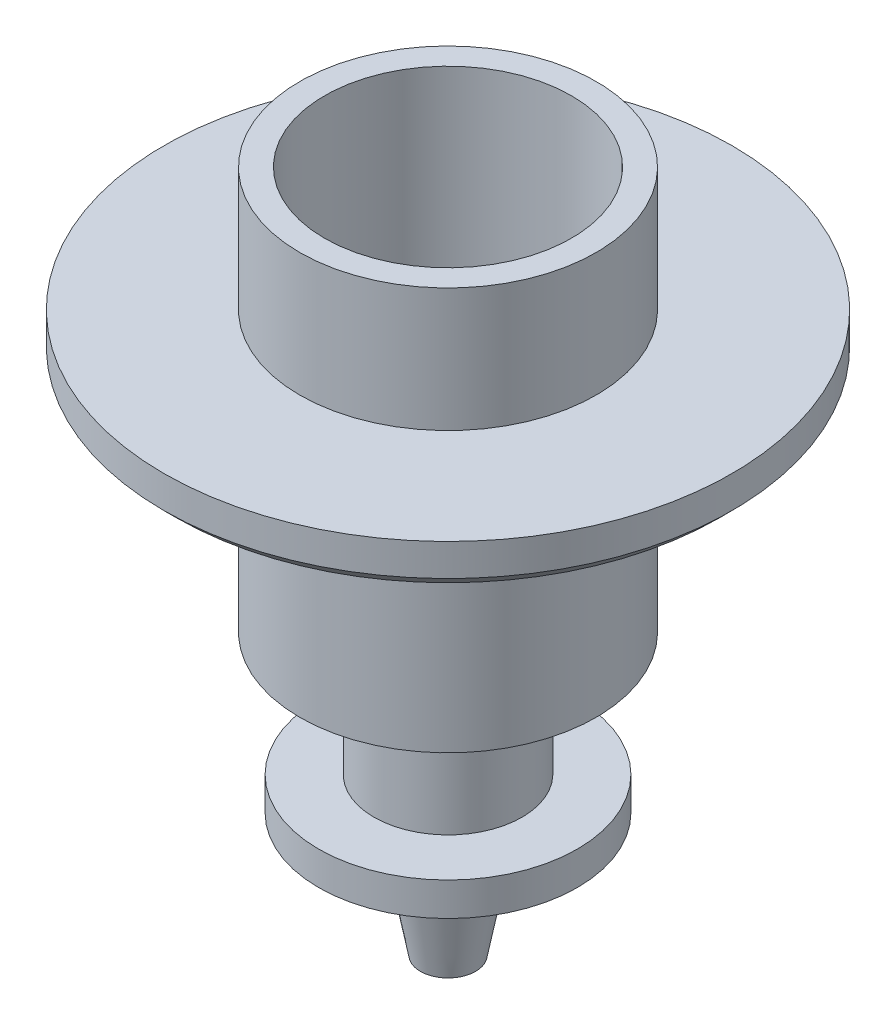
ISO-10303-21;
HEADER;
FILE_DESCRIPTION(('STEP AP214'),'2;1');
FILE_NAME('part.step','',(''),(''),'','','');
FILE_SCHEMA(('AUTOMOTIVE_DESIGN { 1 0 10303 214 1 1 1 1 }'));
ENDSEC;
DATA;
#1=APPLICATION_CONTEXT('core data for automotive mechanical design processes');
#2=APPLICATION_PROTOCOL_DEFINITION('international standard','automotive_design',2000,#1);
#3=PRODUCT_CONTEXT('',#1,'mechanical');
#4=PRODUCT('Part','Part','',(#3));
#5=PRODUCT_RELATED_PRODUCT_CATEGORY('part','',(#4));
#6=PRODUCT_DEFINITION_FORMATION('','',#4);
#7=PRODUCT_DEFINITION_CONTEXT('part definition',#1,'design');
#8=PRODUCT_DEFINITION('design','',#6,#7);
#9=PRODUCT_DEFINITION_SHAPE('','',#8);
#10=(LENGTH_UNIT() NAMED_UNIT(*) SI_UNIT(.MILLI.,.METRE.));
#11=(NAMED_UNIT(*) PLANE_ANGLE_UNIT() SI_UNIT($,.RADIAN.));
#12=(NAMED_UNIT(*) SI_UNIT($,.STERADIAN.) SOLID_ANGLE_UNIT());
#13=UNCERTAINTY_MEASURE_WITH_UNIT(LENGTH_MEASURE(1.E-05),#10,'distance_accuracy_value','');
#14=(GEOMETRIC_REPRESENTATION_CONTEXT(3) GLOBAL_UNCERTAINTY_ASSIGNED_CONTEXT((#13)) GLOBAL_UNIT_ASSIGNED_CONTEXT((#10,
#11,#12)) REPRESENTATION_CONTEXT('',''));
#15=CARTESIAN_POINT('',(0.,0.,0.));
#16=DIRECTION('',(0.,0.,1.));
#17=DIRECTION('',(1.,0.,0.));
#18=AXIS2_PLACEMENT_3D('',#15,#16,#17);
#19=CARTESIAN_POINT('',(0.,-2.29516988950285,0.));
#20=DIRECTION('',(0.,1.,0.));
#21=DIRECTION('',(0.,0.,1.));
#22=AXIS2_PLACEMENT_3D('',#19,#20,#21);
#23=CYLINDRICAL_SURFACE('',#22,0.3);
#24=CARTESIAN_POINT('',(0.,-2.29516988950285,0.));
#25=DIRECTION('',(0.,1.,0.));
#26=DIRECTION('',(0.,0.,1.));
#27=AXIS2_PLACEMENT_3D('',#24,#25,#26);
#28=CIRCLE('',#27,0.3);
#29=CARTESIAN_POINT('',(0.,-2.29516988950285,0.3));
#30=VERTEX_POINT('',#29);
#31=EDGE_CURVE('E80',#30,#30,#28,.T.);
#32=ORIENTED_EDGE('',*,*,#31,.F.);
#33=EDGE_LOOP('',(#32));
#34=FACE_BOUND('',#33,.T.);
#35=CARTESIAN_POINT('',(0.,4.02857142857143,0.));
#36=DIRECTION('',(0.,1.,0.));
#37=DIRECTION('',(0.,0.,1.));
#38=AXIS2_PLACEMENT_3D('',#35,#36,#37);
#39=CIRCLE('',#38,0.3);
#40=CARTESIAN_POINT('',(0.,4.02857142857143,0.3));
#41=VERTEX_POINT('',#40);
#42=EDGE_CURVE('E87',#41,#41,#39,.T.);
#43=ORIENTED_EDGE('',*,*,#42,.T.);
#44=EDGE_LOOP('',(#43));
#45=FACE_BOUND('',#44,.T.);
#46=ADVANCED_FACE('F30',(#34,#45),#23,.F.);
#47=CARTESIAN_POINT('',(-3.,11.5285714285714,0.));
#48=DIRECTION('',(0.,1.,0.));
#49=DIRECTION('',(0.,0.,1.));
#50=AXIS2_PLACEMENT_3D('',#47,#48,#49);
#51=PLANE('',#50);
#52=CARTESIAN_POINT('',(0.,11.5285714285714,0.));
#53=DIRECTION('',(0.,1.,0.));
#54=DIRECTION('',(0.,0.,1.));
#55=AXIS2_PLACEMENT_3D('',#52,#53,#54);
#56=CIRCLE('',#55,2.5);
#57=CARTESIAN_POINT('',(0.,11.5285714285714,2.5));
#58=VERTEX_POINT('',#57);
#59=EDGE_CURVE('E84',#58,#58,#56,.T.);
#60=ORIENTED_EDGE('',*,*,#59,.F.);
#61=EDGE_LOOP('',(#60));
#62=FACE_BOUND('',#61,.T.);
#63=CARTESIAN_POINT('',(0.,11.5285714285714,0.));
#64=DIRECTION('',(0.,1.,0.));
#65=DIRECTION('',(0.,0.,1.));
#66=AXIS2_PLACEMENT_3D('',#63,#64,#65);
#67=CIRCLE('',#66,3.);
#68=CARTESIAN_POINT('',(0.,11.5285714285714,3.));
#69=VERTEX_POINT('',#68);
#70=EDGE_CURVE('E10',#69,#69,#67,.T.);
#71=ORIENTED_EDGE('',*,*,#70,.T.);
#72=EDGE_LOOP('',(#71));
#73=FACE_BOUND('',#72,.T.);
#74=ADVANCED_FACE('F32',(#62,#73),#51,.T.);
#75=CARTESIAN_POINT('',(0.,11.5285714285714,0.));
#76=DIRECTION('',(0.,1.,0.));
#77=DIRECTION('',(0.,0.,1.));
#78=AXIS2_PLACEMENT_3D('',#75,#76,#77);
#79=CYLINDRICAL_SURFACE('',#78,3.);
#80=CARTESIAN_POINT('',(0.,9.02857142857143,0.));
#81=DIRECTION('',(0.,1.,0.));
#82=DIRECTION('',(0.,0.,1.));
#83=AXIS2_PLACEMENT_3D('',#80,#81,#82);
#84=CIRCLE('',#83,3.);
#85=CARTESIAN_POINT('',(0.,9.02857142857143,3.));
#86=VERTEX_POINT('',#85);
#87=EDGE_CURVE('E37',#86,#86,#84,.T.);
#88=ORIENTED_EDGE('',*,*,#87,.T.);
#89=EDGE_LOOP('',(#88));
#90=FACE_BOUND('',#89,.T.);
#91=ORIENTED_EDGE('',*,*,#70,.F.);
#92=EDGE_LOOP('',(#91));
#93=FACE_BOUND('',#92,.T.);
#94=ADVANCED_FACE('F108',(#90,#93),#79,.T.);
#95=CARTESIAN_POINT('',(-3.,9.02857142857143,0.));
#96=DIRECTION('',(0.,1.,0.));
#97=DIRECTION('',(0.,0.,1.));
#98=AXIS2_PLACEMENT_3D('',#95,#96,#97);
#99=PLANE('',#98);
#100=CARTESIAN_POINT('',(0.,9.02857142857143,0.));
#101=DIRECTION('',(0.,1.,0.));
#102=DIRECTION('',(0.,0.,1.));
#103=AXIS2_PLACEMENT_3D('',#100,#101,#102);
#104=CIRCLE('',#103,5.75);
#105=CARTESIAN_POINT('',(0.,9.02857142857143,5.75));
#106=VERTEX_POINT('',#105);
#107=EDGE_CURVE('E41',#106,#106,#104,.T.);
#108=ORIENTED_EDGE('',*,*,#107,.T.);
#109=EDGE_LOOP('',(#108));
#110=FACE_BOUND('',#109,.T.);
#111=ORIENTED_EDGE('',*,*,#87,.F.);
#112=EDGE_LOOP('',(#111));
#113=FACE_BOUND('',#112,.T.);
#114=ADVANCED_FACE('F113',(#110,#113),#99,.T.);
#115=CARTESIAN_POINT('',(0.,11.5285714285714,0.));
#116=DIRECTION('',(0.,1.,0.));
#117=DIRECTION('',(0.,0.,1.));
#118=AXIS2_PLACEMENT_3D('',#115,#116,#117);
#119=CYLINDRICAL_SURFACE('',#118,5.75);
#120=CARTESIAN_POINT('',(0.,8.37857142857143,0.));
#121=DIRECTION('',(0.,1.,0.));
#122=DIRECTION('',(0.,0.,1.));
#123=AXIS2_PLACEMENT_3D('',#120,#121,#122);
#124=CIRCLE('',#123,5.75);
#125=CARTESIAN_POINT('',(0.,8.37857142857143,5.75));
#126=VERTEX_POINT('',#125);
#127=EDGE_CURVE('E45',#126,#126,#124,.T.);
#128=ORIENTED_EDGE('',*,*,#127,.T.);
#129=EDGE_LOOP('',(#128));
#130=FACE_BOUND('',#129,.T.);
#131=ORIENTED_EDGE('',*,*,#107,.F.);
#132=EDGE_LOOP('',(#131));
#133=FACE_BOUND('',#132,.T.);
#134=ADVANCED_FACE('F162',(#130,#133),#119,.T.);
#135=CARTESIAN_POINT('',(0.,8.37857142857143,0.));
#136=DIRECTION('',(0.,1.,0.));
#137=DIRECTION('',(0.,0.,1.));
#138=AXIS2_PLACEMENT_3D('',#135,#136,#137);
#139=CONICAL_SURFACE('',#138,5.75,0.785398163397445);
#140=CARTESIAN_POINT('',(0.,8.12857142857143,0.));
#141=DIRECTION('',(0.,1.,0.));
#142=DIRECTION('',(0.,0.,1.));
#143=AXIS2_PLACEMENT_3D('',#140,#141,#142);
#144=CIRCLE('',#143,5.5);
#145=CARTESIAN_POINT('',(0.,8.12857142857143,5.5));
#146=VERTEX_POINT('',#145);
#147=EDGE_CURVE('E50',#146,#146,#144,.T.);
#148=ORIENTED_EDGE('',*,*,#147,.T.);
#149=EDGE_LOOP('',(#148));
#150=FACE_BOUND('',#149,.T.);
#151=ORIENTED_EDGE('',*,*,#127,.F.);
#152=EDGE_LOOP('',(#151));
#153=FACE_BOUND('',#152,.T.);
#154=ADVANCED_FACE('F158',(#150,#153),#139,.T.);
#155=CARTESIAN_POINT('',(-5.5,8.12857142857143,0.));
#156=DIRECTION('',(0.,-1.,0.));
#157=DIRECTION('',(0.,0.,-1.));
#158=AXIS2_PLACEMENT_3D('',#155,#156,#157);
#159=PLANE('',#158);
#160=CARTESIAN_POINT('',(0.,8.12857142857143,0.));
#161=DIRECTION('',(0.,1.,0.));
#162=DIRECTION('',(0.,0.,1.));
#163=AXIS2_PLACEMENT_3D('',#160,#161,#162);
#164=CIRCLE('',#163,3.);
#165=CARTESIAN_POINT('',(0.,8.12857142857143,3.));
#166=VERTEX_POINT('',#165);
#167=EDGE_CURVE('E53',#166,#166,#164,.T.);
#168=ORIENTED_EDGE('',*,*,#167,.T.);
#169=EDGE_LOOP('',(#168));
#170=FACE_BOUND('',#169,.T.);
#171=ORIENTED_EDGE('',*,*,#147,.F.);
#172=EDGE_LOOP('',(#171));
#173=FACE_BOUND('',#172,.T.);
#174=ADVANCED_FACE('F154',(#170,#173),#159,.T.);
#175=CARTESIAN_POINT('',(0.,11.5285714285714,0.));
#176=DIRECTION('',(0.,1.,0.));
#177=DIRECTION('',(0.,0.,1.));
#178=AXIS2_PLACEMENT_3D('',#175,#176,#177);
#179=CYLINDRICAL_SURFACE('',#178,3.);
#180=CARTESIAN_POINT('',(0.,3.37857142857143,0.));
#181=DIRECTION('',(0.,1.,0.));
#182=DIRECTION('',(0.,0.,1.));
#183=AXIS2_PLACEMENT_3D('',#180,#181,#182);
#184=CIRCLE('',#183,3.);
#185=CARTESIAN_POINT('',(0.,3.37857142857143,3.));
#186=VERTEX_POINT('',#185);
#187=EDGE_CURVE('E56',#186,#186,#184,.T.);
#188=ORIENTED_EDGE('',*,*,#187,.T.);
#189=EDGE_LOOP('',(#188));
#190=FACE_BOUND('',#189,.T.);
#191=ORIENTED_EDGE('',*,*,#167,.F.);
#192=EDGE_LOOP('',(#191));
#193=FACE_BOUND('',#192,.T.);
#194=ADVANCED_FACE('F150',(#190,#193),#179,.T.);
#195=CARTESIAN_POINT('',(0.,3.37857142857143,0.));
#196=DIRECTION('',(0.,1.,0.));
#197=DIRECTION('',(0.,0.,1.));
#198=AXIS2_PLACEMENT_3D('',#195,#196,#197);
#199=CONICAL_SURFACE('',#198,3.,1.22173047639603);
#200=CARTESIAN_POINT('',(0.,2.87857142857143,0.));
#201=DIRECTION('',(0.,1.,0.));
#202=DIRECTION('',(0.,0.,1.));
#203=AXIS2_PLACEMENT_3D('',#200,#201,#202);
#204=CIRCLE('',#203,1.6262612902727);
#205=CARTESIAN_POINT('',(0.,2.87857142857143,1.6262612902727));
#206=VERTEX_POINT('',#205);
#207=EDGE_CURVE('E59',#206,#206,#204,.T.);
#208=ORIENTED_EDGE('',*,*,#207,.T.);
#209=EDGE_LOOP('',(#208));
#210=FACE_BOUND('',#209,.T.);
#211=ORIENTED_EDGE('',*,*,#187,.F.);
#212=EDGE_LOOP('',(#211));
#213=FACE_BOUND('',#212,.T.);
#214=ADVANCED_FACE('F146',(#210,#213),#199,.T.);
#215=CARTESIAN_POINT('',(-1.6262612902727,2.87857142857143,0.));
#216=DIRECTION('',(0.,-1.,0.));
#217=DIRECTION('',(0.,0.,-1.));
#218=AXIS2_PLACEMENT_3D('',#215,#216,#217);
#219=PLANE('',#218);
#220=CARTESIAN_POINT('',(0.,2.87857142857143,0.));
#221=DIRECTION('',(0.,1.,0.));
#222=DIRECTION('',(0.,0.,1.));
#223=AXIS2_PLACEMENT_3D('',#220,#221,#222);
#224=CIRCLE('',#223,1.5);
#225=CARTESIAN_POINT('',(0.,2.87857142857143,1.5));
#226=VERTEX_POINT('',#225);
#227=EDGE_CURVE('E62',#226,#226,#224,.T.);
#228=ORIENTED_EDGE('',*,*,#227,.T.);
#229=EDGE_LOOP('',(#228));
#230=FACE_BOUND('',#229,.T.);
#231=ORIENTED_EDGE('',*,*,#207,.F.);
#232=EDGE_LOOP('',(#231));
#233=FACE_BOUND('',#232,.T.);
#234=ADVANCED_FACE('F142',(#230,#233),#219,.T.);
#235=CARTESIAN_POINT('',(0.,11.5285714285714,0.));
#236=DIRECTION('',(0.,1.,0.));
#237=DIRECTION('',(0.,0.,1.));
#238=AXIS2_PLACEMENT_3D('',#235,#236,#237);
#239=CYLINDRICAL_SURFACE('',#238,1.5);
#240=CARTESIAN_POINT('',(0.,0.878571428571432,0.));
#241=DIRECTION('',(0.,1.,0.));
#242=DIRECTION('',(0.,0.,1.));
#243=AXIS2_PLACEMENT_3D('',#240,#241,#242);
#244=CIRCLE('',#243,1.5);
#245=CARTESIAN_POINT('',(0.,0.878571428571432,1.5));
#246=VERTEX_POINT('',#245);
#247=EDGE_CURVE('E65',#246,#246,#244,.T.);
#248=ORIENTED_EDGE('',*,*,#247,.T.);
#249=EDGE_LOOP('',(#248));
#250=FACE_BOUND('',#249,.T.);
#251=ORIENTED_EDGE('',*,*,#227,.F.);
#252=EDGE_LOOP('',(#251));
#253=FACE_BOUND('',#252,.T.);
#254=ADVANCED_FACE('F138',(#250,#253),#239,.T.);
#255=CARTESIAN_POINT('',(-1.5,0.878571428571432,0.));
#256=DIRECTION('',(0.,1.,0.));
#257=DIRECTION('',(0.,0.,1.));
#258=AXIS2_PLACEMENT_3D('',#255,#256,#257);
#259=PLANE('',#258);
#260=CARTESIAN_POINT('',(0.,0.878571428571432,0.));
#261=DIRECTION('',(0.,1.,0.));
#262=DIRECTION('',(0.,0.,1.));
#263=AXIS2_PLACEMENT_3D('',#260,#261,#262);
#264=CIRCLE('',#263,2.61848242910657);
#265=CARTESIAN_POINT('',(0.,0.878571428571432,2.61848242910657));
#266=VERTEX_POINT('',#265);
#267=EDGE_CURVE('E68',#266,#266,#264,.T.);
#268=ORIENTED_EDGE('',*,*,#267,.T.);
#269=EDGE_LOOP('',(#268));
#270=FACE_BOUND('',#269,.T.);
#271=ORIENTED_EDGE('',*,*,#247,.F.);
#272=EDGE_LOOP('',(#271));
#273=FACE_BOUND('',#272,.T.);
#274=ADVANCED_FACE('F134',(#270,#273),#259,.T.);
#275=CARTESIAN_POINT('',(0.,11.5285714285714,0.));
#276=DIRECTION('',(0.,1.,0.));
#277=DIRECTION('',(0.,0.,1.));
#278=AXIS2_PLACEMENT_3D('',#275,#276,#277);
#279=CYLINDRICAL_SURFACE('',#278,2.61848242910657);
#280=CARTESIAN_POINT('',(0.,0.203307318342861,0.));
#281=DIRECTION('',(0.,1.,0.));
#282=DIRECTION('',(0.,0.,1.));
#283=AXIS2_PLACEMENT_3D('',#280,#281,#282);
#284=CIRCLE('',#283,2.61848242910657);
#285=CARTESIAN_POINT('',(0.,0.203307318342861,2.61848242910657));
#286=VERTEX_POINT('',#285);
#287=EDGE_CURVE('E71',#286,#286,#284,.T.);
#288=ORIENTED_EDGE('',*,*,#287,.T.);
#289=EDGE_LOOP('',(#288));
#290=FACE_BOUND('',#289,.T.);
#291=ORIENTED_EDGE('',*,*,#267,.F.);
#292=EDGE_LOOP('',(#291));
#293=FACE_BOUND('',#292,.T.);
#294=ADVANCED_FACE('F130',(#290,#293),#279,.T.);
#295=CARTESIAN_POINT('',(-2.61848242910657,0.203307318342861,0.));
#296=DIRECTION('',(0.,-1.,0.));
#297=DIRECTION('',(0.,0.,-1.));
#298=AXIS2_PLACEMENT_3D('',#295,#296,#297);
#299=PLANE('',#298);
#300=CARTESIAN_POINT('',(0.,0.203307318342861,0.));
#301=DIRECTION('',(0.,1.,0.));
#302=DIRECTION('',(0.,0.,1.));
#303=AXIS2_PLACEMENT_3D('',#300,#301,#302);
#304=CIRCLE('',#303,1.03161177006943);
#305=CARTESIAN_POINT('',(0.,0.203307318342861,1.03161177006943));
#306=VERTEX_POINT('',#305);
#307=EDGE_CURVE('E74',#306,#306,#304,.T.);
#308=ORIENTED_EDGE('',*,*,#307,.T.);
#309=EDGE_LOOP('',(#308));
#310=FACE_BOUND('',#309,.T.);
#311=ORIENTED_EDGE('',*,*,#287,.F.);
#312=EDGE_LOOP('',(#311));
#313=FACE_BOUND('',#312,.T.);
#314=ADVANCED_FACE('F126',(#310,#313),#299,.T.);
#315=CARTESIAN_POINT('',(0.,0.203307318342861,0.));
#316=DIRECTION('',(0.,1.,0.));
#317=DIRECTION('',(0.,0.,1.));
#318=AXIS2_PLACEMENT_3D('',#315,#316,#317);
#319=CONICAL_SURFACE('',#318,1.03161177006943,0.186979269918911);
#320=CARTESIAN_POINT('',(0.,-2.29516988950285,0.));
#321=DIRECTION('',(0.,1.,0.));
#322=DIRECTION('',(0.,0.,1.));
#323=AXIS2_PLACEMENT_3D('',#320,#321,#322);
#324=CIRCLE('',#323,0.558926892909427);
#325=CARTESIAN_POINT('',(0.,-2.29516988950285,0.558926892909427));
#326=VERTEX_POINT('',#325);
#327=EDGE_CURVE('E77',#326,#326,#324,.T.);
#328=ORIENTED_EDGE('',*,*,#327,.T.);
#329=EDGE_LOOP('',(#328));
#330=FACE_BOUND('',#329,.T.);
#331=ORIENTED_EDGE('',*,*,#307,.F.);
#332=EDGE_LOOP('',(#331));
#333=FACE_BOUND('',#332,.T.);
#334=ADVANCED_FACE('F122',(#330,#333),#319,.T.);
#335=CARTESIAN_POINT('',(-0.558926892909427,-2.29516988950285,0.));
#336=DIRECTION('',(0.,-1.,0.));
#337=DIRECTION('',(0.,0.,-1.));
#338=AXIS2_PLACEMENT_3D('',#335,#336,#337);
#339=PLANE('',#338);
#340=ORIENTED_EDGE('',*,*,#31,.T.);
#341=EDGE_LOOP('',(#340));
#342=FACE_BOUND('',#341,.T.);
#343=ORIENTED_EDGE('',*,*,#327,.F.);
#344=EDGE_LOOP('',(#343));
#345=FACE_BOUND('',#344,.T.);
#346=ADVANCED_FACE('F103',(#342,#345),#339,.T.);
#347=CARTESIAN_POINT('',(0.,4.02857142857143,0.));
#348=DIRECTION('',(0.,1.,0.));
#349=DIRECTION('',(0.,0.,1.));
#350=AXIS2_PLACEMENT_3D('',#347,#348,#349);
#351=CYLINDRICAL_SURFACE('',#350,2.5);
#352=CARTESIAN_POINT('',(0.,4.02857142857143,0.));
#353=DIRECTION('',(0.,1.,0.));
#354=DIRECTION('',(0.,0.,1.));
#355=AXIS2_PLACEMENT_3D('',#352,#353,#354);
#356=CIRCLE('',#355,2.5);
#357=CARTESIAN_POINT('',(0.,4.02857142857143,2.5));
#358=VERTEX_POINT('',#357);
#359=EDGE_CURVE('E83',#358,#358,#356,.T.);
#360=ORIENTED_EDGE('',*,*,#359,.F.);
#361=EDGE_LOOP('',(#360));
#362=FACE_BOUND('',#361,.T.);
#363=ORIENTED_EDGE('',*,*,#59,.T.);
#364=EDGE_LOOP('',(#363));
#365=FACE_BOUND('',#364,.T.);
#366=ADVANCED_FACE('F97',(#362,#365),#351,.F.);
#367=CARTESIAN_POINT('',(0.,4.02857142857143,0.));
#368=DIRECTION('',(0.,1.,0.));
#369=DIRECTION('',(0.,0.,1.));
#370=AXIS2_PLACEMENT_3D('',#367,#368,#369);
#371=PLANE('',#370);
#372=ORIENTED_EDGE('',*,*,#42,.F.);
#373=EDGE_LOOP('',(#372));
#374=FACE_BOUND('',#373,.T.);
#375=ORIENTED_EDGE('',*,*,#359,.T.);
#376=EDGE_LOOP('',(#375));
#377=FACE_BOUND('',#376,.T.);
#378=ADVANCED_FACE('F94',(#374,#377),#371,.T.);
#379=CLOSED_SHELL('',(#46,#74,#94,#114,#134,#154,#174,#194,#214,#234,#254,#274,#294,#314,#334,
#346,#366,#378));
#380=MANIFOLD_SOLID_BREP('B2',#379);
#381=ADVANCED_BREP_SHAPE_REPRESENTATION('',(#18,#380),#14);
#382=SHAPE_DEFINITION_REPRESENTATION(#9,#381);
ENDSEC;
END-ISO-10303-21;
